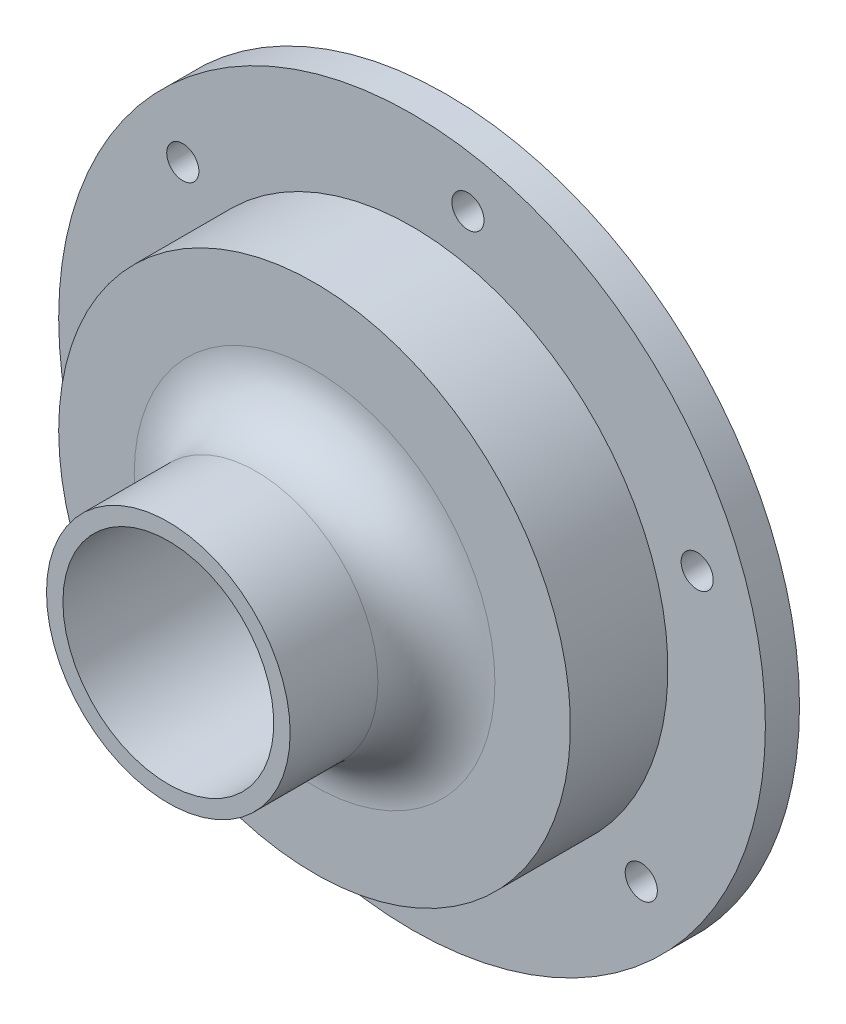
ISO-10303-21;
HEADER;
FILE_DESCRIPTION(('STEP AP214'),'2;1');
FILE_NAME('part.step','',(''),(''),'','','');
FILE_SCHEMA(('AUTOMOTIVE_DESIGN { 1 0 10303 214 1 1 1 1 }'));
ENDSEC;
DATA;
#1=APPLICATION_CONTEXT('core data for automotive mechanical design processes');
#2=APPLICATION_PROTOCOL_DEFINITION('international standard','automotive_design',2000,#1);
#3=PRODUCT_CONTEXT('',#1,'mechanical');
#4=PRODUCT('Part','Part','',(#3));
#5=PRODUCT_RELATED_PRODUCT_CATEGORY('part','',(#4));
#6=PRODUCT_DEFINITION_FORMATION('','',#4);
#7=PRODUCT_DEFINITION_CONTEXT('part definition',#1,'design');
#8=PRODUCT_DEFINITION('design','',#6,#7);
#9=PRODUCT_DEFINITION_SHAPE('','',#8);
#10=(LENGTH_UNIT() NAMED_UNIT(*) SI_UNIT(.MILLI.,.METRE.));
#11=(NAMED_UNIT(*) PLANE_ANGLE_UNIT() SI_UNIT($,.RADIAN.));
#12=(NAMED_UNIT(*) SI_UNIT($,.STERADIAN.) SOLID_ANGLE_UNIT());
#13=UNCERTAINTY_MEASURE_WITH_UNIT(LENGTH_MEASURE(1.E-05),#10,'distance_accuracy_value','');
#14=(GEOMETRIC_REPRESENTATION_CONTEXT(3) GLOBAL_UNCERTAINTY_ASSIGNED_CONTEXT((#13)) GLOBAL_UNIT_ASSIGNED_CONTEXT((#10,
#11,#12)) REPRESENTATION_CONTEXT('',''));
#15=CARTESIAN_POINT('',(0.,0.,0.));
#16=DIRECTION('',(0.,0.,1.));
#17=DIRECTION('',(1.,0.,0.));
#18=AXIS2_PLACEMENT_3D('',#15,#16,#17);
#19=CARTESIAN_POINT('',(-72.5,0.,0.));
#20=DIRECTION('',(0.,0.,-1.));
#21=DIRECTION('',(-1.,0.,0.));
#22=AXIS2_PLACEMENT_3D('',#19,#20,#21);
#23=PLANE('',#22);
#24=CARTESIAN_POINT('',(11.4705811168068,60.9296788834699,0.));
#25=DIRECTION('',(0.,0.,-1.));
#26=DIRECTION('',(-0.499999999999998,0.86602540378444,0.));
#27=AXIS2_PLACEMENT_3D('',#24,#25,#26);
#28=CIRCLE('',#27,7.27349999999999);
#29=CARTESIAN_POINT('',(7.83383111680683,67.228714657896,0.));
#30=VERTEX_POINT('',#29);
#31=EDGE_CURVE('E117',#30,#30,#28,.T.);
#32=ORIENTED_EDGE('',*,*,#31,.F.);
#33=EDGE_LOOP('',(#32));
#34=FACE_BOUND('',#33,.T.);
#35=CARTESIAN_POINT('',(58.5019403159166,20.53102479841,0.));
#36=DIRECTION('',(0.,0.,-1.));
#37=DIRECTION('',(0.500000000000004,0.866025403784436,0.));
#38=AXIS2_PLACEMENT_3D('',#35,#36,#37);
#39=CIRCLE('',#38,7.27349999999999);
#40=CARTESIAN_POINT('',(62.1386903159167,26.8300605728361,0.));
#41=VERTEX_POINT('',#40);
#42=EDGE_CURVE('E105',#41,#41,#39,.T.);
#43=ORIENTED_EDGE('',*,*,#42,.F.);
#44=EDGE_LOOP('',(#43));
#45=FACE_BOUND('',#44,.T.);
#46=CARTESIAN_POINT('',(47.0313591991099,-40.3986540850596,0.));
#47=DIRECTION('',(0.,0.,-1.));
#48=DIRECTION('',(1.,0.,0.));
#49=AXIS2_PLACEMENT_3D('',#46,#47,#48);
#50=CIRCLE('',#49,7.27349999999999);
#51=CARTESIAN_POINT('',(54.3048591991099,-40.3986540850596,0.));
#52=VERTEX_POINT('',#51);
#53=EDGE_CURVE('E93',#52,#52,#50,.T.);
#54=ORIENTED_EDGE('',*,*,#53,.F.);
#55=EDGE_LOOP('',(#54));
#56=FACE_BOUND('',#55,.T.);
#57=CARTESIAN_POINT('',(-11.4705811168072,-60.9296788834698,0.));
#58=DIRECTION('',(0.,0.,-1.));
#59=DIRECTION('',(0.499999999999992,-0.866025403784443,0.));
#60=AXIS2_PLACEMENT_3D('',#57,#58,#59);
#61=CIRCLE('',#60,7.27349999999999);
#62=CARTESIAN_POINT('',(-7.8338311168073,-67.2287146578959,0.));
#63=VERTEX_POINT('',#62);
#64=EDGE_CURVE('E80',#63,#63,#61,.T.);
#65=ORIENTED_EDGE('',*,*,#64,.F.);
#66=EDGE_LOOP('',(#65));
#67=FACE_BOUND('',#66,.T.);
#68=CARTESIAN_POINT('',(-58.5019403159168,-20.5310247984096,0.));
#69=DIRECTION('',(0.,0.,-1.));
#70=DIRECTION('',(-0.50000000000001,-0.866025403784433,0.));
#71=AXIS2_PLACEMENT_3D('',#68,#69,#70);
#72=CIRCLE('',#71,7.27349999999999);
#73=CARTESIAN_POINT('',(-62.1386903159169,-26.8300605728357,0.));
#74=VERTEX_POINT('',#73);
#75=EDGE_CURVE('E87',#74,#74,#72,.T.);
#76=ORIENTED_EDGE('',*,*,#75,.F.);
#77=EDGE_LOOP('',(#76));
#78=FACE_BOUND('',#77,.T.);
#79=CARTESIAN_POINT('',(-47.0313591991099,40.3986540850596,0.));
#80=DIRECTION('',(0.,0.,-1.));
#81=DIRECTION('',(-1.,0.,0.));
#82=AXIS2_PLACEMENT_3D('',#79,#80,#81);
#83=CIRCLE('',#82,7.27349999999999);
#84=CARTESIAN_POINT('',(-54.3048591991099,40.3986540850596,0.));
#85=VERTEX_POINT('',#84);
#86=EDGE_CURVE('E73',#85,#85,#83,.T.);
#87=ORIENTED_EDGE('',*,*,#86,.F.);
#88=EDGE_LOOP('',(#87));
#89=FACE_BOUND('',#88,.T.);
#90=CARTESIAN_POINT('',(0.,0.,0.));
#91=DIRECTION('',(0.,0.,-1.));
#92=DIRECTION('',(-1.,0.,0.));
#93=AXIS2_PLACEMENT_3D('',#90,#91,#92);
#94=CIRCLE('',#93,72.5);
#95=CARTESIAN_POINT('',(-72.5,0.,0.));
#96=VERTEX_POINT('',#95);
#97=EDGE_CURVE('E44',#96,#96,#94,.T.);
#98=ORIENTED_EDGE('',*,*,#97,.T.);
#99=EDGE_LOOP('',(#98));
#100=FACE_BOUND('',#99,.T.);
#101=CARTESIAN_POINT('',(0.,0.,0.));
#102=DIRECTION('',(0.,0.,-1.));
#103=DIRECTION('',(-1.,0.,0.));
#104=AXIS2_PLACEMENT_3D('',#101,#102,#103);
#105=CIRCLE('',#104,21.63);
#106=CARTESIAN_POINT('',(-21.63,0.,0.));
#107=VERTEX_POINT('',#106);
#108=EDGE_CURVE('E64',#107,#107,#105,.T.);
#109=ORIENTED_EDGE('',*,*,#108,.F.);
#110=EDGE_LOOP('',(#109));
#111=FACE_BOUND('',#110,.T.);
#112=ADVANCED_FACE('F32',(#34,#45,#56,#67,#78,#89,#100,#111),#23,.T.);
#113=CARTESIAN_POINT('',(0.,0.,0.));
#114=DIRECTION('',(0.,0.,-1.));
#115=DIRECTION('',(-1.,0.,0.));
#116=AXIS2_PLACEMENT_3D('',#113,#114,#115);
#117=CYLINDRICAL_SURFACE('',#116,72.5);
#118=CARTESIAN_POINT('',(0.,0.,7.));
#119=DIRECTION('',(0.,0.,-1.));
#120=DIRECTION('',(-1.,0.,0.));
#121=AXIS2_PLACEMENT_3D('',#118,#119,#120);
#122=CIRCLE('',#121,72.5);
#123=CARTESIAN_POINT('',(-72.5,0.,7.));
#124=VERTEX_POINT('',#123);
#125=EDGE_CURVE('E49',#124,#124,#122,.T.);
#126=ORIENTED_EDGE('',*,*,#125,.T.);
#127=EDGE_LOOP('',(#126));
#128=FACE_BOUND('',#127,.T.);
#129=ORIENTED_EDGE('',*,*,#97,.F.);
#130=EDGE_LOOP('',(#129));
#131=FACE_BOUND('',#130,.T.);
#132=ADVANCED_FACE('F141',(#128,#131),#117,.T.);
#133=CARTESIAN_POINT('',(-72.5,0.,7.));
#134=DIRECTION('',(0.,0.,1.));
#135=DIRECTION('',(1.,0.,0.));
#136=AXIS2_PLACEMENT_3D('',#133,#134,#135);
#137=PLANE('',#136);
#138=CARTESIAN_POINT('',(11.4705811168068,60.9296788834699,7.));
#139=DIRECTION('',(0.,0.,1.));
#140=DIRECTION('',(0.499999999999998,-0.86602540378444,0.));
#141=AXIS2_PLACEMENT_3D('',#138,#139,#140);
#142=CIRCLE('',#141,3.29999999999999);
#143=CARTESIAN_POINT('',(13.1205811168068,58.0717950509812,7.));
#144=VERTEX_POINT('',#143);
#145=EDGE_CURVE('E131',#144,#144,#142,.T.);
#146=ORIENTED_EDGE('',*,*,#145,.F.);
#147=EDGE_LOOP('',(#146));
#148=FACE_BOUND('',#147,.T.);
#149=CARTESIAN_POINT('',(58.5019403159166,20.53102479841,7.));
#150=DIRECTION('',(0.,0.,1.));
#151=DIRECTION('',(-0.500000000000004,-0.866025403784436,0.));
#152=AXIS2_PLACEMENT_3D('',#149,#150,#151);
#153=CIRCLE('',#152,3.29999999999999);
#154=CARTESIAN_POINT('',(56.8519403159166,17.6731409659214,7.));
#155=VERTEX_POINT('',#154);
#156=EDGE_CURVE('E121',#155,#155,#153,.T.);
#157=ORIENTED_EDGE('',*,*,#156,.F.);
#158=EDGE_LOOP('',(#157));
#159=FACE_BOUND('',#158,.T.);
#160=CARTESIAN_POINT('',(47.0313591991099,-40.3986540850596,7.));
#161=DIRECTION('',(0.,0.,1.));
#162=DIRECTION('',(-1.,0.,0.));
#163=AXIS2_PLACEMENT_3D('',#160,#161,#162);
#164=CIRCLE('',#163,3.29999999999999);
#165=CARTESIAN_POINT('',(43.7313591991099,-40.3986540850596,7.));
#166=VERTEX_POINT('',#165);
#167=EDGE_CURVE('E109',#166,#166,#164,.T.);
#168=ORIENTED_EDGE('',*,*,#167,.F.);
#169=EDGE_LOOP('',(#168));
#170=FACE_BOUND('',#169,.T.);
#171=CARTESIAN_POINT('',(-11.4705811168072,-60.9296788834698,7.));
#172=DIRECTION('',(0.,0.,1.));
#173=DIRECTION('',(-0.499999999999992,0.866025403784443,0.));
#174=AXIS2_PLACEMENT_3D('',#171,#172,#173);
#175=CIRCLE('',#174,3.29999999999999);
#176=CARTESIAN_POINT('',(-13.1205811168072,-58.0717950509811,7.));
#177=VERTEX_POINT('',#176);
#178=EDGE_CURVE('E97',#177,#177,#175,.T.);
#179=ORIENTED_EDGE('',*,*,#178,.F.);
#180=EDGE_LOOP('',(#179));
#181=FACE_BOUND('',#180,.T.);
#182=CARTESIAN_POINT('',(-58.5019403159168,-20.5310247984096,7.));
#183=DIRECTION('',(0.,0.,1.));
#184=DIRECTION('',(0.50000000000001,0.866025403784433,0.));
#185=AXIS2_PLACEMENT_3D('',#182,#183,#184);
#186=CIRCLE('',#185,3.29999999999999);
#187=CARTESIAN_POINT('',(-56.8519403159168,-17.673140965921,7.));
#188=VERTEX_POINT('',#187);
#189=EDGE_CURVE('E84',#188,#188,#186,.T.);
#190=ORIENTED_EDGE('',*,*,#189,.F.);
#191=EDGE_LOOP('',(#190));
#192=FACE_BOUND('',#191,.T.);
#193=CARTESIAN_POINT('',(-47.0313591991099,40.3986540850596,7.));
#194=DIRECTION('',(0.,0.,1.));
#195=DIRECTION('',(1.,0.,0.));
#196=AXIS2_PLACEMENT_3D('',#193,#194,#195);
#197=CIRCLE('',#196,3.29999999999999);
#198=CARTESIAN_POINT('',(-43.7313591991099,40.3986540850596,7.));
#199=VERTEX_POINT('',#198);
#200=EDGE_CURVE('E36',#199,#199,#197,.T.);
#201=ORIENTED_EDGE('',*,*,#200,.F.);
#202=EDGE_LOOP('',(#201));
#203=FACE_BOUND('',#202,.T.);
#204=CARTESIAN_POINT('',(0.,0.,7.));
#205=DIRECTION('',(0.,0.,-1.));
#206=DIRECTION('',(-1.,0.,0.));
#207=AXIS2_PLACEMENT_3D('',#204,#205,#206);
#208=CIRCLE('',#207,52.5);
#209=CARTESIAN_POINT('',(-52.5,0.,7.));
#210=VERTEX_POINT('',#209);
#211=EDGE_CURVE('E52',#210,#210,#208,.T.);
#212=ORIENTED_EDGE('',*,*,#211,.T.);
#213=EDGE_LOOP('',(#212));
#214=FACE_BOUND('',#213,.T.);
#215=ORIENTED_EDGE('',*,*,#125,.F.);
#216=EDGE_LOOP('',(#215));
#217=FACE_BOUND('',#216,.T.);
#218=ADVANCED_FACE('F181',(#148,#159,#170,#181,#192,#203,#214,#217),#137,.T.);
#219=CARTESIAN_POINT('',(0.,0.,0.));
#220=DIRECTION('',(0.,0.,-1.));
#221=DIRECTION('',(-1.,0.,0.));
#222=AXIS2_PLACEMENT_3D('',#219,#220,#221);
#223=CYLINDRICAL_SURFACE('',#222,52.5);
#224=CARTESIAN_POINT('',(0.,0.,27.));
#225=DIRECTION('',(0.,0.,-1.));
#226=DIRECTION('',(-1.,0.,0.));
#227=AXIS2_PLACEMENT_3D('',#224,#225,#226);
#228=CIRCLE('',#227,52.5);
#229=CARTESIAN_POINT('',(-52.5,0.,27.));
#230=VERTEX_POINT('',#229);
#231=EDGE_CURVE('E55',#230,#230,#228,.T.);
#232=ORIENTED_EDGE('',*,*,#231,.T.);
#233=EDGE_LOOP('',(#232));
#234=FACE_BOUND('',#233,.T.);
#235=ORIENTED_EDGE('',*,*,#211,.F.);
#236=EDGE_LOOP('',(#235));
#237=FACE_BOUND('',#236,.T.);
#238=ADVANCED_FACE('F175',(#234,#237),#223,.T.);
#239=CARTESIAN_POINT('',(-52.5,0.,27.));
#240=DIRECTION('',(0.,0.,1.));
#241=DIRECTION('',(1.,0.,0.));
#242=AXIS2_PLACEMENT_3D('',#239,#240,#241);
#243=PLANE('',#242);
#244=CARTESIAN_POINT('',(0.,0.,27.));
#245=DIRECTION('',(0.,0.,1.));
#246=DIRECTION('',(1.,0.,0.));
#247=AXIS2_PLACEMENT_3D('',#244,#245,#246);
#248=CIRCLE('',#247,37.);
#249=CARTESIAN_POINT('',(37.,0.,27.));
#250=VERTEX_POINT('',#249);
#251=EDGE_CURVE('E40',#250,#250,#248,.F.);
#252=ORIENTED_EDGE('',*,*,#251,.T.);
#253=EDGE_LOOP('',(#252));
#254=FACE_BOUND('',#253,.T.);
#255=ORIENTED_EDGE('',*,*,#231,.F.);
#256=EDGE_LOOP('',(#255));
#257=FACE_BOUND('',#256,.T.);
#258=ADVANCED_FACE('F170',(#254,#257),#243,.T.);
#259=CARTESIAN_POINT('',(0.,0.,0.));
#260=DIRECTION('',(0.,0.,-1.));
#261=DIRECTION('',(-1.,0.,0.));
#262=AXIS2_PLACEMENT_3D('',#259,#260,#261);
#263=CYLINDRICAL_SURFACE('',#262,25.);
#264=CARTESIAN_POINT('',(0.,0.,39.));
#265=DIRECTION('',(0.,0.,1.));
#266=DIRECTION('',(1.,0.,0.));
#267=AXIS2_PLACEMENT_3D('',#264,#265,#266);
#268=CIRCLE('',#267,25.);
#269=CARTESIAN_POINT('',(25.,0.,39.));
#270=VERTEX_POINT('',#269);
#271=EDGE_CURVE('E10',#270,#270,#268,.T.);
#272=ORIENTED_EDGE('',*,*,#271,.T.);
#273=EDGE_LOOP('',(#272));
#274=FACE_BOUND('',#273,.T.);
#275=CARTESIAN_POINT('',(0.,0.,57.));
#276=DIRECTION('',(0.,0.,-1.));
#277=DIRECTION('',(-1.,0.,0.));
#278=AXIS2_PLACEMENT_3D('',#275,#276,#277);
#279=CIRCLE('',#278,25.);
#280=CARTESIAN_POINT('',(-25.,0.,57.));
#281=VERTEX_POINT('',#280);
#282=EDGE_CURVE('E58',#281,#281,#279,.T.);
#283=ORIENTED_EDGE('',*,*,#282,.T.);
#284=EDGE_LOOP('',(#283));
#285=FACE_BOUND('',#284,.T.);
#286=ADVANCED_FACE('F165',(#274,#285),#263,.T.);
#287=CARTESIAN_POINT('',(-25.,0.,57.));
#288=DIRECTION('',(0.,0.,1.));
#289=DIRECTION('',(1.,0.,0.));
#290=AXIS2_PLACEMENT_3D('',#287,#288,#289);
#291=PLANE('',#290);
#292=CARTESIAN_POINT('',(0.,0.,57.));
#293=DIRECTION('',(0.,0.,-1.));
#294=DIRECTION('',(-1.,0.,0.));
#295=AXIS2_PLACEMENT_3D('',#292,#293,#294);
#296=CIRCLE('',#295,21.63);
#297=CARTESIAN_POINT('',(-21.63,0.,57.));
#298=VERTEX_POINT('',#297);
#299=EDGE_CURVE('E61',#298,#298,#296,.T.);
#300=ORIENTED_EDGE('',*,*,#299,.T.);
#301=EDGE_LOOP('',(#300));
#302=FACE_BOUND('',#301,.T.);
#303=ORIENTED_EDGE('',*,*,#282,.F.);
#304=EDGE_LOOP('',(#303));
#305=FACE_BOUND('',#304,.T.);
#306=ADVANCED_FACE('F159',(#302,#305),#291,.T.);
#307=CARTESIAN_POINT('',(0.,0.,0.));
#308=DIRECTION('',(0.,0.,-1.));
#309=DIRECTION('',(-1.,0.,0.));
#310=AXIS2_PLACEMENT_3D('',#307,#308,#309);
#311=CYLINDRICAL_SURFACE('',#310,21.63);
#312=ORIENTED_EDGE('',*,*,#108,.T.);
#313=EDGE_LOOP('',(#312));
#314=FACE_BOUND('',#313,.T.);
#315=ORIENTED_EDGE('',*,*,#299,.F.);
#316=EDGE_LOOP('',(#315));
#317=FACE_BOUND('',#316,.T.);
#318=ADVANCED_FACE('F156',(#314,#317),#311,.F.);
#319=CARTESIAN_POINT('',(0.,0.,39.));
#320=DIRECTION('',(0.,0.,1.));
#321=DIRECTION('',(1.,0.,0.));
#322=AXIS2_PLACEMENT_3D('',#319,#320,#321);
#323=TOROIDAL_SURFACE('',#322,37.,12.);
#324=ORIENTED_EDGE('',*,*,#271,.F.);
#325=EDGE_LOOP('',(#324));
#326=FACE_BOUND('',#325,.T.);
#327=ORIENTED_EDGE('',*,*,#251,.F.);
#328=EDGE_LOOP('',(#327));
#329=FACE_BOUND('',#328,.T.);
#330=ADVANCED_FACE('F34',(#326,#329),#323,.F.);
#331=CARTESIAN_POINT('',(-47.0313591991099,40.3986540850596,0.));
#332=DIRECTION('',(0.,0.,-1.));
#333=DIRECTION('',(-1.,0.,0.));
#334=AXIS2_PLACEMENT_3D('',#331,#332,#333);
#335=CYLINDRICAL_SURFACE('',#334,3.29999999999999);
#336=ORIENTED_EDGE('',*,*,#200,.T.);
#337=EDGE_LOOP('',(#336));
#338=FACE_BOUND('',#337,.T.);
#339=CARTESIAN_POINT('',(-47.0313591991099,40.3986540850596,1.));
#340=DIRECTION('',(0.,0.,-1.));
#341=DIRECTION('',(-1.,0.,0.));
#342=AXIS2_PLACEMENT_3D('',#339,#340,#341);
#343=CIRCLE('',#342,3.3);
#344=CARTESIAN_POINT('',(-50.3313591991099,40.3986540850596,1.));
#345=VERTEX_POINT('',#344);
#346=EDGE_CURVE('E67',#345,#345,#343,.T.);
#347=ORIENTED_EDGE('',*,*,#346,.T.);
#348=EDGE_LOOP('',(#347));
#349=FACE_BOUND('',#348,.T.);
#350=ADVANCED_FACE('F226',(#338,#349),#335,.F.);
#351=CARTESIAN_POINT('',(-43.7313591991099,40.3986540850596,1.));
#352=DIRECTION('',(0.,0.,1.));
#353=DIRECTION('',(1.,0.,0.));
#354=AXIS2_PLACEMENT_3D('',#351,#352,#353);
#355=PLANE('',#354);
#356=ORIENTED_EDGE('',*,*,#346,.F.);
#357=EDGE_LOOP('',(#356));
#358=FACE_BOUND('',#357,.T.);
#359=CARTESIAN_POINT('',(-47.0313591991099,40.3986540850596,1.));
#360=DIRECTION('',(0.,0.,-1.));
#361=DIRECTION('',(-1.,0.,0.));
#362=AXIS2_PLACEMENT_3D('',#359,#360,#361);
#363=CIRCLE('',#362,7.27349999999999);
#364=CARTESIAN_POINT('',(-54.3048591991099,40.3986540850596,1.));
#365=VERTEX_POINT('',#364);
#366=EDGE_CURVE('E70',#365,#365,#363,.T.);
#367=ORIENTED_EDGE('',*,*,#366,.T.);
#368=EDGE_LOOP('',(#367));
#369=FACE_BOUND('',#368,.T.);
#370=ADVANCED_FACE('F235',(#358,#369),#355,.F.);
#371=CARTESIAN_POINT('',(-47.0313591991099,40.3986540850596,0.));
#372=DIRECTION('',(0.,0.,-1.));
#373=DIRECTION('',(-1.,0.,0.));
#374=AXIS2_PLACEMENT_3D('',#371,#372,#373);
#375=CYLINDRICAL_SURFACE('',#374,7.27349999999999);
#376=ORIENTED_EDGE('',*,*,#366,.F.);
#377=EDGE_LOOP('',(#376));
#378=FACE_BOUND('',#377,.T.);
#379=ORIENTED_EDGE('',*,*,#86,.T.);
#380=EDGE_LOOP('',(#379));
#381=FACE_BOUND('',#380,.T.);
#382=ADVANCED_FACE('F245',(#378,#381),#375,.F.);
#383=CARTESIAN_POINT('',(-58.5019403159168,-20.5310247984096,0.));
#384=DIRECTION('',(0.,0.,-1.));
#385=DIRECTION('',(-0.50000000000001,-0.866025403784433,0.));
#386=AXIS2_PLACEMENT_3D('',#383,#384,#385);
#387=CYLINDRICAL_SURFACE('',#386,3.29999999999999);
#388=ORIENTED_EDGE('',*,*,#189,.T.);
#389=EDGE_LOOP('',(#388));
#390=FACE_BOUND('',#389,.T.);
#391=CARTESIAN_POINT('',(-58.5019403159168,-20.5310247984096,1.));
#392=DIRECTION('',(0.,0.,-1.));
#393=DIRECTION('',(-0.50000000000001,-0.866025403784433,0.));
#394=AXIS2_PLACEMENT_3D('',#391,#392,#393);
#395=CIRCLE('',#394,3.3);
#396=CARTESIAN_POINT('',(-60.1519403159168,-23.3889086308982,1.));
#397=VERTEX_POINT('',#396);
#398=EDGE_CURVE('E77',#397,#397,#395,.T.);
#399=ORIENTED_EDGE('',*,*,#398,.T.);
#400=EDGE_LOOP('',(#399));
#401=FACE_BOUND('',#400,.T.);
#402=ADVANCED_FACE('F254',(#390,#401),#387,.F.);
#403=CARTESIAN_POINT('',(-56.8519403159167,-17.673140965921,1.));
#404=DIRECTION('',(0.,0.,1.));
#405=DIRECTION('',(0.50000000000001,0.866025403784433,0.));
#406=AXIS2_PLACEMENT_3D('',#403,#404,#405);
#407=PLANE('',#406);
#408=ORIENTED_EDGE('',*,*,#398,.F.);
#409=EDGE_LOOP('',(#408));
#410=FACE_BOUND('',#409,.T.);
#411=CARTESIAN_POINT('',(-58.5019403159168,-20.5310247984096,1.));
#412=DIRECTION('',(0.,0.,-1.));
#413=DIRECTION('',(-0.50000000000001,-0.866025403784433,0.));
#414=AXIS2_PLACEMENT_3D('',#411,#412,#413);
#415=CIRCLE('',#414,7.27349999999999);
#416=CARTESIAN_POINT('',(-62.1386903159169,-26.8300605728357,1.));
#417=VERTEX_POINT('',#416);
#418=EDGE_CURVE('E81',#417,#417,#415,.T.);
#419=ORIENTED_EDGE('',*,*,#418,.T.);
#420=EDGE_LOOP('',(#419));
#421=FACE_BOUND('',#420,.T.);
#422=ADVANCED_FACE('F274',(#410,#421),#407,.F.);
#423=CARTESIAN_POINT('',(-58.5019403159168,-20.5310247984096,0.));
#424=DIRECTION('',(0.,0.,-1.));
#425=DIRECTION('',(-0.50000000000001,-0.866025403784433,0.));
#426=AXIS2_PLACEMENT_3D('',#423,#424,#425);
#427=CYLINDRICAL_SURFACE('',#426,7.27349999999999);
#428=ORIENTED_EDGE('',*,*,#418,.F.);
#429=EDGE_LOOP('',(#428));
#430=FACE_BOUND('',#429,.T.);
#431=ORIENTED_EDGE('',*,*,#75,.T.);
#432=EDGE_LOOP('',(#431));
#433=FACE_BOUND('',#432,.T.);
#434=ADVANCED_FACE('F281',(#430,#433),#427,.F.);
#435=CARTESIAN_POINT('',(-11.4705811168072,-60.9296788834698,0.));
#436=DIRECTION('',(0.,0.,-1.));
#437=DIRECTION('',(0.499999999999992,-0.866025403784443,0.));
#438=AXIS2_PLACEMENT_3D('',#435,#436,#437);
#439=CYLINDRICAL_SURFACE('',#438,3.29999999999999);
#440=ORIENTED_EDGE('',*,*,#178,.T.);
#441=EDGE_LOOP('',(#440));
#442=FACE_BOUND('',#441,.T.);
#443=CARTESIAN_POINT('',(-11.4705811168072,-60.9296788834698,1.));
#444=DIRECTION('',(0.,0.,-1.));
#445=DIRECTION('',(0.499999999999992,-0.866025403784443,0.));
#446=AXIS2_PLACEMENT_3D('',#443,#444,#445);
#447=CIRCLE('',#446,3.3);
#448=CARTESIAN_POINT('',(-9.82058111680726,-63.7875627159585,1.));
#449=VERTEX_POINT('',#448);
#450=EDGE_CURVE('E90',#449,#449,#447,.T.);
#451=ORIENTED_EDGE('',*,*,#450,.T.);
#452=EDGE_LOOP('',(#451));
#453=FACE_BOUND('',#452,.T.);
#454=ADVANCED_FACE('F289',(#442,#453),#439,.F.);
#455=CARTESIAN_POINT('',(-13.1205811168072,-58.0717950509811,1.));
#456=DIRECTION('',(0.,0.,1.));
#457=DIRECTION('',(-0.499999999999992,0.866025403784443,0.));
#458=AXIS2_PLACEMENT_3D('',#455,#456,#457);
#459=PLANE('',#458);
#460=ORIENTED_EDGE('',*,*,#450,.F.);
#461=EDGE_LOOP('',(#460));
#462=FACE_BOUND('',#461,.T.);
#463=CARTESIAN_POINT('',(-11.4705811168072,-60.9296788834698,1.));
#464=DIRECTION('',(0.,0.,-1.));
#465=DIRECTION('',(0.499999999999992,-0.866025403784443,0.));
#466=AXIS2_PLACEMENT_3D('',#463,#464,#465);
#467=CIRCLE('',#466,7.27349999999999);
#468=CARTESIAN_POINT('',(-7.8338311168073,-67.2287146578959,1.));
#469=VERTEX_POINT('',#468);
#470=EDGE_CURVE('E94',#469,#469,#467,.T.);
#471=ORIENTED_EDGE('',*,*,#470,.T.);
#472=EDGE_LOOP('',(#471));
#473=FACE_BOUND('',#472,.T.);
#474=ADVANCED_FACE('F297',(#462,#473),#459,.F.);
#475=CARTESIAN_POINT('',(-11.4705811168072,-60.9296788834698,0.));
#476=DIRECTION('',(0.,0.,-1.));
#477=DIRECTION('',(0.499999999999992,-0.866025403784443,0.));
#478=AXIS2_PLACEMENT_3D('',#475,#476,#477);
#479=CYLINDRICAL_SURFACE('',#478,7.27349999999999);
#480=ORIENTED_EDGE('',*,*,#470,.F.);
#481=EDGE_LOOP('',(#480));
#482=FACE_BOUND('',#481,.T.);
#483=ORIENTED_EDGE('',*,*,#64,.T.);
#484=EDGE_LOOP('',(#483));
#485=FACE_BOUND('',#484,.T.);
#486=ADVANCED_FACE('F305',(#482,#485),#479,.F.);
#487=CARTESIAN_POINT('',(47.0313591991099,-40.3986540850596,0.));
#488=DIRECTION('',(0.,0.,-1.));
#489=DIRECTION('',(1.,0.,0.));
#490=AXIS2_PLACEMENT_3D('',#487,#488,#489);
#491=CYLINDRICAL_SURFACE('',#490,3.29999999999999);
#492=ORIENTED_EDGE('',*,*,#167,.T.);
#493=EDGE_LOOP('',(#492));
#494=FACE_BOUND('',#493,.T.);
#495=CARTESIAN_POINT('',(47.0313591991099,-40.3986540850596,1.));
#496=DIRECTION('',(0.,0.,-1.));
#497=DIRECTION('',(1.,0.,0.));
#498=AXIS2_PLACEMENT_3D('',#495,#496,#497);
#499=CIRCLE('',#498,3.3);
#500=CARTESIAN_POINT('',(50.3313591991099,-40.3986540850596,1.));
#501=VERTEX_POINT('',#500);
#502=EDGE_CURVE('E102',#501,#501,#499,.T.);
#503=ORIENTED_EDGE('',*,*,#502,.T.);
#504=EDGE_LOOP('',(#503));
#505=FACE_BOUND('',#504,.T.);
#506=ADVANCED_FACE('F313',(#494,#505),#491,.F.);
#507=CARTESIAN_POINT('',(43.7313591991099,-40.3986540850596,1.));
#508=DIRECTION('',(0.,0.,1.));
#509=DIRECTION('',(-1.,0.,0.));
#510=AXIS2_PLACEMENT_3D('',#507,#508,#509);
#511=PLANE('',#510);
#512=ORIENTED_EDGE('',*,*,#502,.F.);
#513=EDGE_LOOP('',(#512));
#514=FACE_BOUND('',#513,.T.);
#515=CARTESIAN_POINT('',(47.0313591991099,-40.3986540850596,1.));
#516=DIRECTION('',(0.,0.,-1.));
#517=DIRECTION('',(1.,0.,0.));
#518=AXIS2_PLACEMENT_3D('',#515,#516,#517);
#519=CIRCLE('',#518,7.27349999999999);
#520=CARTESIAN_POINT('',(54.3048591991099,-40.3986540850596,1.));
#521=VERTEX_POINT('',#520);
#522=EDGE_CURVE('E106',#521,#521,#519,.T.);
#523=ORIENTED_EDGE('',*,*,#522,.T.);
#524=EDGE_LOOP('',(#523));
#525=FACE_BOUND('',#524,.T.);
#526=ADVANCED_FACE('F321',(#514,#525),#511,.F.);
#527=CARTESIAN_POINT('',(47.0313591991099,-40.3986540850596,0.));
#528=DIRECTION('',(0.,0.,-1.));
#529=DIRECTION('',(1.,0.,0.));
#530=AXIS2_PLACEMENT_3D('',#527,#528,#529);
#531=CYLINDRICAL_SURFACE('',#530,7.27349999999999);
#532=ORIENTED_EDGE('',*,*,#522,.F.);
#533=EDGE_LOOP('',(#532));
#534=FACE_BOUND('',#533,.T.);
#535=ORIENTED_EDGE('',*,*,#53,.T.);
#536=EDGE_LOOP('',(#535));
#537=FACE_BOUND('',#536,.T.);
#538=ADVANCED_FACE('F329',(#534,#537),#531,.F.);
#539=CARTESIAN_POINT('',(58.5019403159166,20.53102479841,0.));
#540=DIRECTION('',(0.,0.,-1.));
#541=DIRECTION('',(0.500000000000004,0.866025403784436,0.));
#542=AXIS2_PLACEMENT_3D('',#539,#540,#541);
#543=CYLINDRICAL_SURFACE('',#542,3.29999999999999);
#544=ORIENTED_EDGE('',*,*,#156,.T.);
#545=EDGE_LOOP('',(#544));
#546=FACE_BOUND('',#545,.T.);
#547=CARTESIAN_POINT('',(58.5019403159166,20.53102479841,1.));
#548=DIRECTION('',(0.,0.,-1.));
#549=DIRECTION('',(0.500000000000004,0.866025403784436,0.));
#550=AXIS2_PLACEMENT_3D('',#547,#548,#549);
#551=CIRCLE('',#550,3.3);
#552=CARTESIAN_POINT('',(60.1519403159167,23.3889086308987,1.));
#553=VERTEX_POINT('',#552);
#554=EDGE_CURVE('E114',#553,#553,#551,.T.);
#555=ORIENTED_EDGE('',*,*,#554,.T.);
#556=EDGE_LOOP('',(#555));
#557=FACE_BOUND('',#556,.T.);
#558=ADVANCED_FACE('F337',(#546,#557),#543,.F.);
#559=CARTESIAN_POINT('',(56.8519403159166,17.6731409659214,1.));
#560=DIRECTION('',(0.,0.,1.));
#561=DIRECTION('',(-0.500000000000004,-0.866025403784436,0.));
#562=AXIS2_PLACEMENT_3D('',#559,#560,#561);
#563=PLANE('',#562);
#564=ORIENTED_EDGE('',*,*,#554,.F.);
#565=EDGE_LOOP('',(#564));
#566=FACE_BOUND('',#565,.T.);
#567=CARTESIAN_POINT('',(58.5019403159166,20.53102479841,1.));
#568=DIRECTION('',(0.,0.,-1.));
#569=DIRECTION('',(0.500000000000004,0.866025403784436,0.));
#570=AXIS2_PLACEMENT_3D('',#567,#568,#569);
#571=CIRCLE('',#570,7.27349999999999);
#572=CARTESIAN_POINT('',(62.1386903159167,26.8300605728361,1.));
#573=VERTEX_POINT('',#572);
#574=EDGE_CURVE('E118',#573,#573,#571,.T.);
#575=ORIENTED_EDGE('',*,*,#574,.T.);
#576=EDGE_LOOP('',(#575));
#577=FACE_BOUND('',#576,.T.);
#578=ADVANCED_FACE('F345',(#566,#577),#563,.F.);
#579=CARTESIAN_POINT('',(58.5019403159166,20.53102479841,0.));
#580=DIRECTION('',(0.,0.,-1.));
#581=DIRECTION('',(0.500000000000004,0.866025403784436,0.));
#582=AXIS2_PLACEMENT_3D('',#579,#580,#581);
#583=CYLINDRICAL_SURFACE('',#582,7.27349999999999);
#584=ORIENTED_EDGE('',*,*,#574,.F.);
#585=EDGE_LOOP('',(#584));
#586=FACE_BOUND('',#585,.T.);
#587=ORIENTED_EDGE('',*,*,#42,.T.);
#588=EDGE_LOOP('',(#587));
#589=FACE_BOUND('',#588,.T.);
#590=ADVANCED_FACE('F353',(#586,#589),#583,.F.);
#591=CARTESIAN_POINT('',(11.4705811168068,60.9296788834699,0.));
#592=DIRECTION('',(0.,0.,-1.));
#593=DIRECTION('',(-0.499999999999998,0.86602540378444,0.));
#594=AXIS2_PLACEMENT_3D('',#591,#592,#593);
#595=CYLINDRICAL_SURFACE('',#594,3.29999999999999);
#596=ORIENTED_EDGE('',*,*,#145,.T.);
#597=EDGE_LOOP('',(#596));
#598=FACE_BOUND('',#597,.T.);
#599=CARTESIAN_POINT('',(11.4705811168068,60.9296788834699,1.));
#600=DIRECTION('',(0.,0.,-1.));
#601=DIRECTION('',(-0.499999999999998,0.86602540378444,0.));
#602=AXIS2_PLACEMENT_3D('',#599,#600,#601);
#603=CIRCLE('',#602,3.3);
#604=CARTESIAN_POINT('',(9.82058111680682,63.7875627159585,1.));
#605=VERTEX_POINT('',#604);
#606=EDGE_CURVE('E76',#605,#605,#603,.T.);
#607=ORIENTED_EDGE('',*,*,#606,.T.);
#608=EDGE_LOOP('',(#607));
#609=FACE_BOUND('',#608,.T.);
#610=ADVANCED_FACE('F361',(#598,#609),#595,.F.);
#611=CARTESIAN_POINT('',(13.1205811168068,58.0717950509812,1.));
#612=DIRECTION('',(0.,0.,1.));
#613=DIRECTION('',(0.499999999999998,-0.86602540378444,0.));
#614=AXIS2_PLACEMENT_3D('',#611,#612,#613);
#615=PLANE('',#614);
#616=ORIENTED_EDGE('',*,*,#606,.F.);
#617=EDGE_LOOP('',(#616));
#618=FACE_BOUND('',#617,.T.);
#619=CARTESIAN_POINT('',(11.4705811168068,60.9296788834699,1.));
#620=DIRECTION('',(0.,0.,-1.));
#621=DIRECTION('',(-0.499999999999998,0.86602540378444,0.));
#622=AXIS2_PLACEMENT_3D('',#619,#620,#621);
#623=CIRCLE('',#622,7.27349999999999);
#624=CARTESIAN_POINT('',(7.83383111680683,67.228714657896,1.));
#625=VERTEX_POINT('',#624);
#626=EDGE_CURVE('E128',#625,#625,#623,.T.);
#627=ORIENTED_EDGE('',*,*,#626,.T.);
#628=EDGE_LOOP('',(#627));
#629=FACE_BOUND('',#628,.T.);
#630=ADVANCED_FACE('F369',(#618,#629),#615,.F.);
#631=CARTESIAN_POINT('',(11.4705811168068,60.9296788834699,0.));
#632=DIRECTION('',(0.,0.,-1.));
#633=DIRECTION('',(-0.499999999999998,0.86602540378444,0.));
#634=AXIS2_PLACEMENT_3D('',#631,#632,#633);
#635=CYLINDRICAL_SURFACE('',#634,7.27349999999999);
#636=ORIENTED_EDGE('',*,*,#626,.F.);
#637=EDGE_LOOP('',(#636));
#638=FACE_BOUND('',#637,.T.);
#639=ORIENTED_EDGE('',*,*,#31,.T.);
#640=EDGE_LOOP('',(#639));
#641=FACE_BOUND('',#640,.T.);
#642=ADVANCED_FACE('F137',(#638,#641),#635,.F.);
#643=CLOSED_SHELL('',(#112,#132,#218,#238,#258,#286,#306,#318,#330,#350,#370,#382,#402,#422,
#434,#454,#474,#486,#506,#526,#538,#558,#578,#590,#610,#630,#642));
#644=MANIFOLD_SOLID_BREP('B2',#643);
#645=ADVANCED_BREP_SHAPE_REPRESENTATION('',(#18,#644),#14);
#646=SHAPE_DEFINITION_REPRESENTATION(#9,#645);
ENDSEC;
END-ISO-10303-21;
